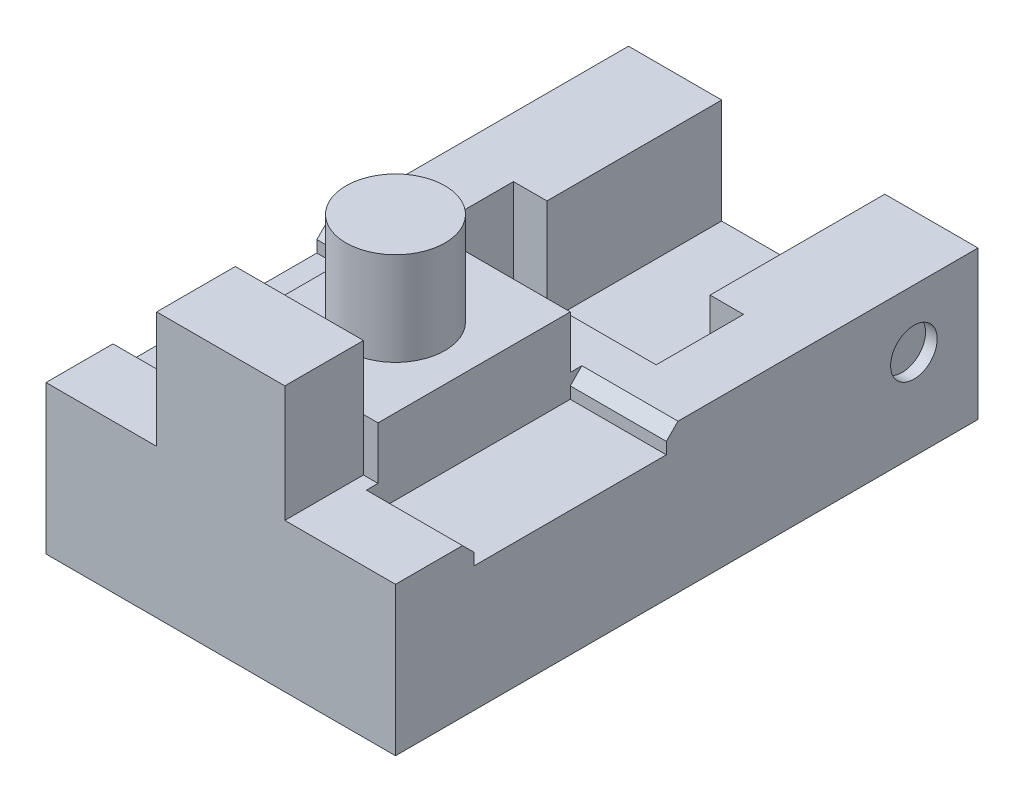
ISO-10303-21;
HEADER;
FILE_DESCRIPTION(('STEP AP214'),'2;1');
FILE_NAME('part.step','',(''),(''),'','','');
FILE_SCHEMA(('AUTOMOTIVE_DESIGN { 1 0 10303 214 1 1 1 1 }'));
ENDSEC;
DATA;
#1=APPLICATION_CONTEXT('core data for automotive mechanical design processes');
#2=APPLICATION_PROTOCOL_DEFINITION('international standard','automotive_design',2000,#1);
#3=PRODUCT_CONTEXT('',#1,'mechanical');
#4=PRODUCT('Part','Part','',(#3));
#5=PRODUCT_RELATED_PRODUCT_CATEGORY('part','',(#4));
#6=PRODUCT_DEFINITION_FORMATION('','',#4);
#7=PRODUCT_DEFINITION_CONTEXT('part definition',#1,'design');
#8=PRODUCT_DEFINITION('design','',#6,#7);
#9=PRODUCT_DEFINITION_SHAPE('','',#8);
#10=(LENGTH_UNIT() NAMED_UNIT(*) SI_UNIT(.MILLI.,.METRE.));
#11=(NAMED_UNIT(*) PLANE_ANGLE_UNIT() SI_UNIT($,.RADIAN.));
#12=(NAMED_UNIT(*) SI_UNIT($,.STERADIAN.) SOLID_ANGLE_UNIT());
#13=UNCERTAINTY_MEASURE_WITH_UNIT(LENGTH_MEASURE(1.E-05),#10,'distance_accuracy_value','');
#14=(GEOMETRIC_REPRESENTATION_CONTEXT(3) GLOBAL_UNCERTAINTY_ASSIGNED_CONTEXT((#13)) GLOBAL_UNIT_ASSIGNED_CONTEXT((#10,
#11,#12)) REPRESENTATION_CONTEXT('',''));
#15=CARTESIAN_POINT('',(0.,0.,0.));
#16=DIRECTION('',(0.,0.,1.));
#17=DIRECTION('',(1.,0.,0.));
#18=AXIS2_PLACEMENT_3D('',#15,#16,#17);
#19=CARTESIAN_POINT('',(0.,1.8,0.));
#20=DIRECTION('',(0.,-1.,0.));
#21=DIRECTION('',(0.,0.,-1.));
#22=AXIS2_PLACEMENT_3D('',#19,#20,#21);
#23=PLANE('',#22);
#24=DIRECTION('',(1.,0.,0.));
#25=VECTOR('',#24,1.);
#26=CARTESIAN_POINT('',(1.35,1.8,5.65));
#27=LINE('',#26,#25);
#28=CARTESIAN_POINT('',(-1.35,1.8,5.65));
#29=VERTEX_POINT('',#28);
#30=CARTESIAN_POINT('',(-1.1,1.8,5.65));
#31=VERTEX_POINT('',#30);
#32=EDGE_CURVE('E407',#29,#31,#27,.T.);
#33=ORIENTED_EDGE('',*,*,#32,.F.);
#34=DIRECTION('',(0.,0.,1.));
#35=VECTOR('',#34,1.);
#36=CARTESIAN_POINT('',(-1.35,1.8,0.));
#37=LINE('',#36,#35);
#38=CARTESIAN_POINT('',(-1.35,1.8,5.85));
#39=VERTEX_POINT('',#38);
#40=EDGE_CURVE('E72',#29,#39,#37,.T.);
#41=ORIENTED_EDGE('',*,*,#40,.T.);
#42=DIRECTION('',(-1.,0.,0.));
#43=VECTOR('',#42,1.);
#44=CARTESIAN_POINT('',(0.,1.8,5.85));
#45=LINE('',#44,#43);
#46=CARTESIAN_POINT('',(-3.,1.8,5.85));
#47=VERTEX_POINT('',#46);
#48=EDGE_CURVE('E565',#39,#47,#45,.T.);
#49=ORIENTED_EDGE('',*,*,#48,.T.);
#50=DIRECTION('',(0.,0.,1.));
#51=VECTOR('',#50,1.);
#52=CARTESIAN_POINT('',(-3.,1.8,7.));
#53=LINE('',#52,#51);
#54=CARTESIAN_POINT('',(-3.,1.8,7.));
#55=VERTEX_POINT('',#54);
#56=EDGE_CURVE('E453',#47,#55,#53,.T.);
#57=ORIENTED_EDGE('',*,*,#56,.T.);
#58=DIRECTION('',(1.,0.,0.));
#59=VECTOR('',#58,1.);
#60=CARTESIAN_POINT('',(-3.,1.8,7.));
#61=LINE('',#60,#59);
#62=CARTESIAN_POINT('',(-1.1,1.8,7.));
#63=VERTEX_POINT('',#62);
#64=EDGE_CURVE('E460',#55,#63,#61,.T.);
#65=ORIENTED_EDGE('',*,*,#64,.T.);
#66=DIRECTION('',(0.,0.,1.));
#67=VECTOR('',#66,1.);
#68=CARTESIAN_POINT('',(-1.1,1.8,5.65));
#69=LINE('',#68,#67);
#70=EDGE_CURVE('E310',#31,#63,#69,.T.);
#71=ORIENTED_EDGE('',*,*,#70,.F.);
#72=EDGE_LOOP('',(#33,#41,#49,#57,#65,#71));
#73=FACE_BOUND('',#72,.T.);
#74=ADVANCED_FACE('F47',(#73),#23,.F.);
#75=CARTESIAN_POINT('',(-3.,1.8,-3.));
#76=VERTEX_POINT('',#75);
#77=CARTESIAN_POINT('',(-3.,1.8,2.15));
#78=VERTEX_POINT('',#77);
#79=EDGE_CURVE('E455',#76,#78,#53,.T.);
#80=ORIENTED_EDGE('',*,*,#79,.T.);
#81=DIRECTION('',(1.,0.,0.));
#82=VECTOR('',#81,1.);
#83=CARTESIAN_POINT('',(0.,1.8,2.15));
#84=LINE('',#83,#82);
#85=CARTESIAN_POINT('',(-1.35,1.8,2.15));
#86=VERTEX_POINT('',#85);
#87=EDGE_CURVE('E587',#78,#86,#84,.T.);
#88=ORIENTED_EDGE('',*,*,#87,.T.);
#89=DIRECTION('',(0.,0.,1.));
#90=VECTOR('',#89,1.);
#91=CARTESIAN_POINT('',(-1.35,1.8,0.));
#92=LINE('',#91,#90);
#93=CARTESIAN_POINT('',(-1.35,1.8,2.35));
#94=VERTEX_POINT('',#93);
#95=EDGE_CURVE('E584',#86,#94,#92,.T.);
#96=ORIENTED_EDGE('',*,*,#95,.T.);
#97=DIRECTION('',(-1.,0.,0.));
#98=VECTOR('',#97,1.);
#99=CARTESIAN_POINT('',(1.35,1.8,2.35));
#100=LINE('',#99,#98);
#101=CARTESIAN_POINT('',(1.35,1.8,2.35));
#102=VERTEX_POINT('',#101);
#103=EDGE_CURVE('E394',#102,#94,#100,.T.);
#104=ORIENTED_EDGE('',*,*,#103,.F.);
#105=DIRECTION('',(0.,0.,-1.));
#106=VECTOR('',#105,1.);
#107=CARTESIAN_POINT('',(1.35,1.8,0.));
#108=LINE('',#107,#106);
#109=CARTESIAN_POINT('',(1.35,1.8,2.15));
#110=VERTEX_POINT('',#109);
#111=EDGE_CURVE('E64',#102,#110,#108,.T.);
#112=ORIENTED_EDGE('',*,*,#111,.T.);
#113=DIRECTION('',(1.,0.,0.));
#114=VECTOR('',#113,1.);
#115=CARTESIAN_POINT('',(0.,1.8,2.15));
#116=LINE('',#115,#114);
#117=CARTESIAN_POINT('',(3.,1.8,2.15));
#118=VERTEX_POINT('',#117);
#119=EDGE_CURVE('E579',#110,#118,#116,.T.);
#120=ORIENTED_EDGE('',*,*,#119,.T.);
#121=DIRECTION('',(0.,0.,-1.));
#122=VECTOR('',#121,1.);
#123=CARTESIAN_POINT('',(3.,1.8,-3.));
#124=LINE('',#123,#122);
#125=CARTESIAN_POINT('',(3.,1.8,-3.));
#126=VERTEX_POINT('',#125);
#127=EDGE_CURVE('E464',#118,#126,#124,.T.);
#128=ORIENTED_EDGE('',*,*,#127,.T.);
#129=DIRECTION('',(-1.,0.,0.));
#130=VECTOR('',#129,1.);
#131=CARTESIAN_POINT('',(1.4,1.8,-3.));
#132=LINE('',#131,#130);
#133=CARTESIAN_POINT('',(1.4,1.8,-3.));
#134=VERTEX_POINT('',#133);
#135=EDGE_CURVE('E469',#126,#134,#132,.T.);
#136=ORIENTED_EDGE('',*,*,#135,.T.);
#137=DIRECTION('',(0.,0.,1.));
#138=VECTOR('',#137,1.);
#139=CARTESIAN_POINT('',(1.4,1.8,0.));
#140=LINE('',#139,#138);
#141=CARTESIAN_POINT('',(1.4,1.8,0.));
#142=VERTEX_POINT('',#141);
#143=EDGE_CURVE('E472',#134,#142,#140,.T.);
#144=ORIENTED_EDGE('',*,*,#143,.T.);
#145=DIRECTION('',(1.,0.,0.));
#146=VECTOR('',#145,1.);
#147=CARTESIAN_POINT('',(1.975,1.8,0.));
#148=LINE('',#147,#146);
#149=CARTESIAN_POINT('',(1.975,1.8,0.));
#150=VERTEX_POINT('',#149);
#151=EDGE_CURVE('E475',#142,#150,#148,.T.);
#152=ORIENTED_EDGE('',*,*,#151,.T.);
#153=DIRECTION('',(0.,0.,1.));
#154=VECTOR('',#153,1.);
#155=CARTESIAN_POINT('',(1.975,1.8,1.5));
#156=LINE('',#155,#154);
#157=CARTESIAN_POINT('',(1.975,1.8,1.5));
#158=VERTEX_POINT('',#157);
#159=EDGE_CURVE('E478',#150,#158,#156,.T.);
#160=ORIENTED_EDGE('',*,*,#159,.T.);
#161=DIRECTION('',(-1.,0.,0.));
#162=VECTOR('',#161,1.);
#163=CARTESIAN_POINT('',(-1.975,1.8,1.5));
#164=LINE('',#163,#162);
#165=CARTESIAN_POINT('',(-1.975,1.8,1.5));
#166=VERTEX_POINT('',#165);
#167=EDGE_CURVE('E481',#158,#166,#164,.T.);
#168=ORIENTED_EDGE('',*,*,#167,.T.);
#169=DIRECTION('',(0.,0.,-1.));
#170=VECTOR('',#169,1.);
#171=CARTESIAN_POINT('',(-1.975,1.8,0.));
#172=LINE('',#171,#170);
#173=CARTESIAN_POINT('',(-1.975,1.8,0.));
#174=VERTEX_POINT('',#173);
#175=EDGE_CURVE('E484',#166,#174,#172,.T.);
#176=ORIENTED_EDGE('',*,*,#175,.T.);
#177=DIRECTION('',(1.,0.,0.));
#178=VECTOR('',#177,1.);
#179=CARTESIAN_POINT('',(-1.4,1.8,0.));
#180=LINE('',#179,#178);
#181=CARTESIAN_POINT('',(-1.4,1.8,0.));
#182=VERTEX_POINT('',#181);
#183=EDGE_CURVE('E487',#174,#182,#180,.T.);
#184=ORIENTED_EDGE('',*,*,#183,.T.);
#185=DIRECTION('',(0.,0.,-1.));
#186=VECTOR('',#185,1.);
#187=CARTESIAN_POINT('',(-1.4,1.8,-3.));
#188=LINE('',#187,#186);
#189=CARTESIAN_POINT('',(-1.4,1.8,-3.));
#190=VERTEX_POINT('',#189);
#191=EDGE_CURVE('E490',#182,#190,#188,.T.);
#192=ORIENTED_EDGE('',*,*,#191,.T.);
#193=DIRECTION('',(-1.,0.,0.));
#194=VECTOR('',#193,1.);
#195=CARTESIAN_POINT('',(-3.,1.8,-3.));
#196=LINE('',#195,#194);
#197=EDGE_CURVE('E449',#190,#76,#196,.T.);
#198=ORIENTED_EDGE('',*,*,#197,.T.);
#199=EDGE_LOOP('',(#80,#88,#96,#104,#112,#120,#128,#136,#144,#152,#160,#168,#176,#184,#192,#198));
#200=FACE_BOUND('',#199,.T.);
#201=ADVANCED_FACE('F623',(#200),#23,.F.);
#202=CARTESIAN_POINT('',(3.,1.8,7.));
#203=VERTEX_POINT('',#202);
#204=CARTESIAN_POINT('',(3.,1.8,5.85));
#205=VERTEX_POINT('',#204);
#206=EDGE_CURVE('E465',#203,#205,#124,.T.);
#207=ORIENTED_EDGE('',*,*,#206,.T.);
#208=DIRECTION('',(-1.,0.,0.));
#209=VECTOR('',#208,1.);
#210=CARTESIAN_POINT('',(0.,1.8,5.85));
#211=LINE('',#210,#209);
#212=CARTESIAN_POINT('',(1.35,1.8,5.85));
#213=VERTEX_POINT('',#212);
#214=EDGE_CURVE('E608',#205,#213,#211,.T.);
#215=ORIENTED_EDGE('',*,*,#214,.T.);
#216=DIRECTION('',(0.,0.,-1.));
#217=VECTOR('',#216,1.);
#218=CARTESIAN_POINT('',(1.35,1.8,0.));
#219=LINE('',#218,#217);
#220=CARTESIAN_POINT('',(1.35,1.8,5.65));
#221=VERTEX_POINT('',#220);
#222=EDGE_CURVE('E605',#213,#221,#219,.T.);
#223=ORIENTED_EDGE('',*,*,#222,.T.);
#224=CARTESIAN_POINT('',(1.1,1.8,5.65));
#225=VERTEX_POINT('',#224);
#226=EDGE_CURVE('E382',#225,#221,#27,.T.);
#227=ORIENTED_EDGE('',*,*,#226,.F.);
#228=DIRECTION('',(0.,0.,-1.));
#229=VECTOR('',#228,1.);
#230=CARTESIAN_POINT('',(1.1,1.8,5.65));
#231=LINE('',#230,#229);
#232=CARTESIAN_POINT('',(1.1,1.8,7.));
#233=VERTEX_POINT('',#232);
#234=EDGE_CURVE('E349',#233,#225,#231,.T.);
#235=ORIENTED_EDGE('',*,*,#234,.F.);
#236=EDGE_CURVE('E459',#233,#203,#61,.T.);
#237=ORIENTED_EDGE('',*,*,#236,.T.);
#238=EDGE_LOOP('',(#207,#215,#223,#227,#235,#237));
#239=FACE_BOUND('',#238,.T.);
#240=ADVANCED_FACE('F646',(#239),#23,.F.);
#241=CARTESIAN_POINT('',(1.35,2.7,5.65));
#242=DIRECTION('',(0.,0.,-1.));
#243=DIRECTION('',(-1.,0.,0.));
#244=AXIS2_PLACEMENT_3D('',#241,#242,#243);
#245=PLANE('',#244);
#246=DIRECTION('',(0.,-1.,0.));
#247=VECTOR('',#246,1.);
#248=CARTESIAN_POINT('',(-1.1,3.8,5.65));
#249=LINE('',#248,#247);
#250=CARTESIAN_POINT('',(-1.1,2.7,5.65));
#251=VERTEX_POINT('',#250);
#252=EDGE_CURVE('E358',#251,#31,#249,.T.);
#253=ORIENTED_EDGE('',*,*,#252,.F.);
#254=DIRECTION('',(1.,0.,0.));
#255=VECTOR('',#254,1.);
#256=CARTESIAN_POINT('',(1.35,2.7,5.65));
#257=LINE('',#256,#255);
#258=CARTESIAN_POINT('',(-1.35,2.7,5.65));
#259=VERTEX_POINT('',#258);
#260=EDGE_CURVE('E395',#259,#251,#257,.T.);
#261=ORIENTED_EDGE('',*,*,#260,.F.);
#262=DIRECTION('',(0.,-1.,0.));
#263=VECTOR('',#262,1.);
#264=CARTESIAN_POINT('',(-1.35,2.7,5.65));
#265=LINE('',#264,#263);
#266=EDGE_CURVE('E424',#259,#29,#265,.T.);
#267=ORIENTED_EDGE('',*,*,#266,.T.);
#268=ORIENTED_EDGE('',*,*,#32,.T.);
#269=EDGE_LOOP('',(#253,#261,#267,#268));
#270=FACE_BOUND('',#269,.T.);
#271=ADVANCED_FACE('F693',(#270),#245,.F.);
#272=DIRECTION('',(0.,-1.,0.));
#273=VECTOR('',#272,1.);
#274=CARTESIAN_POINT('',(1.1,3.8,5.65));
#275=LINE('',#274,#273);
#276=CARTESIAN_POINT('',(1.1,2.7,5.65));
#277=VERTEX_POINT('',#276);
#278=EDGE_CURVE('E368',#277,#225,#275,.T.);
#279=ORIENTED_EDGE('',*,*,#278,.T.);
#280=ORIENTED_EDGE('',*,*,#226,.T.);
#281=DIRECTION('',(0.,-1.,0.));
#282=VECTOR('',#281,1.);
#283=CARTESIAN_POINT('',(1.35,2.7,5.65));
#284=LINE('',#283,#282);
#285=CARTESIAN_POINT('',(1.35,2.7,5.65));
#286=VERTEX_POINT('',#285);
#287=EDGE_CURVE('E420',#286,#221,#284,.T.);
#288=ORIENTED_EDGE('',*,*,#287,.F.);
#289=EDGE_CURVE('E393',#277,#286,#257,.T.);
#290=ORIENTED_EDGE('',*,*,#289,.F.);
#291=EDGE_LOOP('',(#279,#280,#288,#290));
#292=FACE_BOUND('',#291,.T.);
#293=ADVANCED_FACE('F705',(#292),#245,.F.);
#294=CARTESIAN_POINT('',(-3.,1.8,7.));
#295=DIRECTION('',(1.,0.,0.));
#296=DIRECTION('',(0.,0.,-1.));
#297=AXIS2_PLACEMENT_3D('',#294,#295,#296);
#298=PLANE('',#297);
#299=CARTESIAN_POINT('',(-3.,0.8,-1.9));
#300=DIRECTION('',(1.,0.,0.));
#301=DIRECTION('',(0.,0.,-1.));
#302=AXIS2_PLACEMENT_3D('',#299,#300,#301);
#303=CIRCLE('',#302,0.4);
#304=CARTESIAN_POINT('',(-3.,0.8,-2.3));
#305=VERTEX_POINT('',#304);
#306=EDGE_CURVE('E1307',#305,#305,#303,.T.);
#307=ORIENTED_EDGE('',*,*,#306,.T.);
#308=EDGE_LOOP('',(#307));
#309=FACE_BOUND('',#308,.T.);
#310=ORIENTED_EDGE('',*,*,#56,.F.);
#311=DIRECTION('',(0.,0.707106781186545,0.70710678118655));
#312=VECTOR('',#311,1.);
#313=CARTESIAN_POINT('',(-3.,1.6,5.65));
#314=LINE('',#313,#312);
#315=CARTESIAN_POINT('',(-3.,1.6,5.65));
#316=VERTEX_POINT('',#315);
#317=EDGE_CURVE('E573',#47,#316,#314,.F.);
#318=ORIENTED_EDGE('',*,*,#317,.T.);
#319=DIRECTION('',(0.,1.,0.));
#320=VECTOR('',#319,1.);
#321=CARTESIAN_POINT('',(-3.,1.4,5.65));
#322=LINE('',#321,#320);
#323=CARTESIAN_POINT('',(-3.,1.4,5.65));
#324=VERTEX_POINT('',#323);
#325=EDGE_CURVE('E311',#324,#316,#322,.T.);
#326=ORIENTED_EDGE('',*,*,#325,.F.);
#327=DIRECTION('',(0.,0.,1.));
#328=VECTOR('',#327,1.);
#329=CARTESIAN_POINT('',(-3.,1.4,2.35));
#330=LINE('',#329,#328);
#331=CARTESIAN_POINT('',(-3.,1.4,2.35));
#332=VERTEX_POINT('',#331);
#333=EDGE_CURVE('E288',#332,#324,#330,.T.);
#334=ORIENTED_EDGE('',*,*,#333,.F.);
#335=DIRECTION('',(0.,1.,0.));
#336=VECTOR('',#335,1.);
#337=CARTESIAN_POINT('',(-3.,1.4,2.35));
#338=LINE('',#337,#336);
#339=CARTESIAN_POINT('',(-3.,1.6,2.35));
#340=VERTEX_POINT('',#339);
#341=EDGE_CURVE('E278',#332,#340,#338,.T.);
#342=ORIENTED_EDGE('',*,*,#341,.T.);
#343=DIRECTION('',(0.,-0.707106781186545,0.70710678118655));
#344=VECTOR('',#343,1.);
#345=CARTESIAN_POINT('',(-3.,1.6,2.35));
#346=LINE('',#345,#344);
#347=EDGE_CURVE('E570',#340,#78,#346,.F.);
#348=ORIENTED_EDGE('',*,*,#347,.T.);
#349=ORIENTED_EDGE('',*,*,#79,.F.);
#350=DIRECTION('',(0.,-1.,0.));
#351=VECTOR('',#350,1.);
#352=CARTESIAN_POINT('',(-3.,1.8,-3.));
#353=LINE('',#352,#351);
#354=CARTESIAN_POINT('',(-3.,-0.75,-3.));
#355=VERTEX_POINT('',#354);
#356=EDGE_CURVE('E388',#76,#355,#353,.T.);
#357=ORIENTED_EDGE('',*,*,#356,.T.);
#358=DIRECTION('',(0.,0.,-1.));
#359=VECTOR('',#358,1.);
#360=CARTESIAN_POINT('',(-3.,-0.75,-3.));
#361=LINE('',#360,#359);
#362=CARTESIAN_POINT('',(-3.,-0.75,7.));
#363=VERTEX_POINT('',#362);
#364=EDGE_CURVE('E429',#363,#355,#361,.T.);
#365=ORIENTED_EDGE('',*,*,#364,.F.);
#366=DIRECTION('',(0.,-1.,0.));
#367=VECTOR('',#366,1.);
#368=CARTESIAN_POINT('',(-3.,1.8,7.));
#369=LINE('',#368,#367);
#370=EDGE_CURVE('E557',#55,#363,#369,.T.);
#371=ORIENTED_EDGE('',*,*,#370,.F.);
#372=EDGE_LOOP('',(#310,#318,#326,#334,#342,#348,#349,#357,#365,#371));
#373=FACE_BOUND('',#372,.T.);
#374=ADVANCED_FACE('F664',(#309,#373),#298,.F.);
#375=CARTESIAN_POINT('',(-3.,1.8,7.));
#376=DIRECTION('',(0.,0.,-1.));
#377=DIRECTION('',(-1.,0.,0.));
#378=AXIS2_PLACEMENT_3D('',#375,#376,#377);
#379=PLANE('',#378);
#380=ORIENTED_EDGE('',*,*,#370,.T.);
#381=DIRECTION('',(-1.,0.,0.));
#382=VECTOR('',#381,1.);
#383=CARTESIAN_POINT('',(-3.,-0.75,7.));
#384=LINE('',#383,#382);
#385=CARTESIAN_POINT('',(3.,-0.75,7.));
#386=VERTEX_POINT('',#385);
#387=EDGE_CURVE('E441',#386,#363,#384,.T.);
#388=ORIENTED_EDGE('',*,*,#387,.F.);
#389=DIRECTION('',(0.,-1.,0.));
#390=VECTOR('',#389,1.);
#391=CARTESIAN_POINT('',(3.,1.8,7.));
#392=LINE('',#391,#390);
#393=EDGE_CURVE('E554',#203,#386,#392,.T.);
#394=ORIENTED_EDGE('',*,*,#393,.F.);
#395=ORIENTED_EDGE('',*,*,#236,.F.);
#396=DIRECTION('',(0.,-1.,0.));
#397=VECTOR('',#396,1.);
#398=CARTESIAN_POINT('',(1.1,3.8,7.));
#399=LINE('',#398,#397);
#400=CARTESIAN_POINT('',(1.1,3.8,7.));
#401=VERTEX_POINT('',#400);
#402=EDGE_CURVE('E372',#401,#233,#399,.T.);
#403=ORIENTED_EDGE('',*,*,#402,.F.);
#404=DIRECTION('',(1.,0.,0.));
#405=VECTOR('',#404,1.);
#406=CARTESIAN_POINT('',(-1.1,3.8,7.));
#407=LINE('',#406,#405);
#408=CARTESIAN_POINT('',(-1.1,3.8,7.));
#409=VERTEX_POINT('',#408);
#410=EDGE_CURVE('E348',#409,#401,#407,.T.);
#411=ORIENTED_EDGE('',*,*,#410,.F.);
#412=DIRECTION('',(0.,-1.,0.));
#413=VECTOR('',#412,1.);
#414=CARTESIAN_POINT('',(-1.1,3.8,7.));
#415=LINE('',#414,#413);
#416=EDGE_CURVE('E375',#409,#63,#415,.T.);
#417=ORIENTED_EDGE('',*,*,#416,.T.);
#418=ORIENTED_EDGE('',*,*,#64,.F.);
#419=EDGE_LOOP('',(#380,#388,#394,#395,#403,#411,#417,#418));
#420=FACE_BOUND('',#419,.T.);
#421=ADVANCED_FACE('F659',(#420),#379,.F.);
#422=CARTESIAN_POINT('',(3.,1.8,-3.));
#423=DIRECTION('',(-1.,0.,0.));
#424=DIRECTION('',(0.,0.,1.));
#425=AXIS2_PLACEMENT_3D('',#422,#423,#424);
#426=PLANE('',#425);
#427=CARTESIAN_POINT('',(3.,0.8,-1.9));
#428=DIRECTION('',(1.,0.,0.));
#429=DIRECTION('',(0.,0.,-1.));
#430=AXIS2_PLACEMENT_3D('',#427,#428,#429);
#431=CIRCLE('',#430,0.4);
#432=CARTESIAN_POINT('',(3.,0.8,-2.3));
#433=VERTEX_POINT('',#432);
#434=EDGE_CURVE('E300',#433,#433,#431,.T.);
#435=ORIENTED_EDGE('',*,*,#434,.F.);
#436=EDGE_LOOP('',(#435));
#437=FACE_BOUND('',#436,.T.);
#438=ORIENTED_EDGE('',*,*,#127,.F.);
#439=DIRECTION('',(0.,0.707106781186544,-0.707106781186551));
#440=VECTOR('',#439,1.);
#441=CARTESIAN_POINT('',(3.,1.6,2.35));
#442=LINE('',#441,#440);
#443=CARTESIAN_POINT('',(3.,1.6,2.35));
#444=VERTEX_POINT('',#443);
#445=EDGE_CURVE('E598',#118,#444,#442,.F.);
#446=ORIENTED_EDGE('',*,*,#445,.T.);
#447=DIRECTION('',(0.,1.,0.));
#448=VECTOR('',#447,1.);
#449=CARTESIAN_POINT('',(3.,1.4,2.35));
#450=LINE('',#449,#448);
#451=CARTESIAN_POINT('',(3.,1.4,2.35));
#452=VERTEX_POINT('',#451);
#453=EDGE_CURVE('E326',#452,#444,#450,.T.);
#454=ORIENTED_EDGE('',*,*,#453,.F.);
#455=DIRECTION('',(0.,0.,-1.));
#456=VECTOR('',#455,1.);
#457=CARTESIAN_POINT('',(3.,1.4,5.65));
#458=LINE('',#457,#456);
#459=CARTESIAN_POINT('',(3.,1.4,5.65));
#460=VERTEX_POINT('',#459);
#461=EDGE_CURVE('E338',#460,#452,#458,.T.);
#462=ORIENTED_EDGE('',*,*,#461,.F.);
#463=DIRECTION('',(0.,1.,0.));
#464=VECTOR('',#463,1.);
#465=CARTESIAN_POINT('',(3.,1.4,5.65));
#466=LINE('',#465,#464);
#467=CARTESIAN_POINT('',(3.,1.6,5.65));
#468=VERTEX_POINT('',#467);
#469=EDGE_CURVE('E322',#460,#468,#466,.T.);
#470=ORIENTED_EDGE('',*,*,#469,.T.);
#471=DIRECTION('',(0.,-0.707106781186544,-0.707106781186551));
#472=VECTOR('',#471,1.);
#473=CARTESIAN_POINT('',(3.,1.6,5.65));
#474=LINE('',#473,#472);
#475=EDGE_CURVE('E595',#468,#205,#474,.F.);
#476=ORIENTED_EDGE('',*,*,#475,.T.);
#477=ORIENTED_EDGE('',*,*,#206,.F.);
#478=ORIENTED_EDGE('',*,*,#393,.T.);
#479=DIRECTION('',(0.,0.,1.));
#480=VECTOR('',#479,1.);
#481=CARTESIAN_POINT('',(3.,-0.75,7.));
#482=LINE('',#481,#480);
#483=CARTESIAN_POINT('',(3.,-0.75,-3.));
#484=VERTEX_POINT('',#483);
#485=EDGE_CURVE('E437',#484,#386,#482,.T.);
#486=ORIENTED_EDGE('',*,*,#485,.F.);
#487=DIRECTION('',(0.,-1.,0.));
#488=VECTOR('',#487,1.);
#489=CARTESIAN_POINT('',(3.,1.8,-3.));
#490=LINE('',#489,#488);
#491=EDGE_CURVE('E551',#126,#484,#490,.T.);
#492=ORIENTED_EDGE('',*,*,#491,.F.);
#493=EDGE_LOOP('',(#438,#446,#454,#462,#470,#476,#477,#478,#486,#492));
#494=FACE_BOUND('',#493,.T.);
#495=ADVANCED_FACE('F629',(#437,#494),#426,.F.);
#496=CARTESIAN_POINT('',(1.4,1.8,-3.));
#497=DIRECTION('',(0.,0.,1.));
#498=DIRECTION('',(1.,0.,0.));
#499=AXIS2_PLACEMENT_3D('',#496,#497,#498);
#500=PLANE('',#499);
#501=ORIENTED_EDGE('',*,*,#491,.T.);
#502=DIRECTION('',(1.,0.,0.));
#503=VECTOR('',#502,1.);
#504=CARTESIAN_POINT('',(-3.,-0.75,-3.));
#505=LINE('',#504,#503);
#506=EDGE_CURVE('E433',#355,#484,#505,.T.);
#507=ORIENTED_EDGE('',*,*,#506,.F.);
#508=ORIENTED_EDGE('',*,*,#356,.F.);
#509=ORIENTED_EDGE('',*,*,#197,.F.);
#510=DIRECTION('',(0.,-1.,0.));
#511=VECTOR('',#510,1.);
#512=CARTESIAN_POINT('',(-1.4,1.8,-3.));
#513=LINE('',#512,#511);
#514=CARTESIAN_POINT('',(-1.4,0.,-3.));
#515=VERTEX_POINT('',#514);
#516=EDGE_CURVE('E493',#190,#515,#513,.T.);
#517=ORIENTED_EDGE('',*,*,#516,.T.);
#518=DIRECTION('',(1.,0.,0.));
#519=VECTOR('',#518,1.);
#520=CARTESIAN_POINT('',(-3.,0.,-3.));
#521=LINE('',#520,#519);
#522=CARTESIAN_POINT('',(1.4,0.,-3.));
#523=VERTEX_POINT('',#522);
#524=EDGE_CURVE('E428',#515,#523,#521,.T.);
#525=ORIENTED_EDGE('',*,*,#524,.T.);
#526=DIRECTION('',(0.,-1.,0.));
#527=VECTOR('',#526,1.);
#528=CARTESIAN_POINT('',(1.4,1.8,-3.));
#529=LINE('',#528,#527);
#530=EDGE_CURVE('E547',#134,#523,#529,.T.);
#531=ORIENTED_EDGE('',*,*,#530,.F.);
#532=ORIENTED_EDGE('',*,*,#135,.F.);
#533=EDGE_LOOP('',(#501,#507,#508,#509,#517,#525,#531,#532));
#534=FACE_BOUND('',#533,.T.);
#535=ADVANCED_FACE('F669',(#534),#500,.F.);
#536=CARTESIAN_POINT('',(1.4,1.8,0.));
#537=DIRECTION('',(1.,0.,0.));
#538=DIRECTION('',(0.,0.,-1.));
#539=AXIS2_PLACEMENT_3D('',#536,#537,#538);
#540=PLANE('',#539);
#541=DIRECTION('',(0.,0.,1.));
#542=VECTOR('',#541,1.);
#543=CARTESIAN_POINT('',(1.4,0.,0.));
#544=LINE('',#543,#542);
#545=CARTESIAN_POINT('',(1.4,0.,0.));
#546=VERTEX_POINT('',#545);
#547=EDGE_CURVE('E445',#523,#546,#544,.T.);
#548=ORIENTED_EDGE('',*,*,#547,.T.);
#549=DIRECTION('',(0.,-1.,0.));
#550=VECTOR('',#549,1.);
#551=CARTESIAN_POINT('',(1.4,1.8,0.));
#552=LINE('',#551,#550);
#553=EDGE_CURVE('E543',#142,#546,#552,.T.);
#554=ORIENTED_EDGE('',*,*,#553,.F.);
#555=ORIENTED_EDGE('',*,*,#143,.F.);
#556=ORIENTED_EDGE('',*,*,#530,.T.);
#557=EDGE_LOOP('',(#548,#554,#555,#556));
#558=FACE_BOUND('',#557,.T.);
#559=ADVANCED_FACE('F777',(#558),#540,.F.);
#560=CARTESIAN_POINT('',(1.975,1.8,0.));
#561=DIRECTION('',(0.,0.,-1.));
#562=DIRECTION('',(-1.,0.,0.));
#563=AXIS2_PLACEMENT_3D('',#560,#561,#562);
#564=PLANE('',#563);
#565=DIRECTION('',(1.,0.,0.));
#566=VECTOR('',#565,1.);
#567=CARTESIAN_POINT('',(1.975,0.,0.));
#568=LINE('',#567,#566);
#569=CARTESIAN_POINT('',(1.975,0.,0.));
#570=VERTEX_POINT('',#569);
#571=EDGE_CURVE('E497',#546,#570,#568,.T.);
#572=ORIENTED_EDGE('',*,*,#571,.T.);
#573=DIRECTION('',(0.,-1.,0.));
#574=VECTOR('',#573,1.);
#575=CARTESIAN_POINT('',(1.975,1.8,0.));
#576=LINE('',#575,#574);
#577=EDGE_CURVE('E539',#150,#570,#576,.T.);
#578=ORIENTED_EDGE('',*,*,#577,.F.);
#579=ORIENTED_EDGE('',*,*,#151,.F.);
#580=ORIENTED_EDGE('',*,*,#553,.T.);
#581=EDGE_LOOP('',(#572,#578,#579,#580));
#582=FACE_BOUND('',#581,.T.);
#583=ADVANCED_FACE('F774',(#582),#564,.F.);
#584=CARTESIAN_POINT('',(1.975,1.8,1.5));
#585=DIRECTION('',(1.,0.,0.));
#586=DIRECTION('',(0.,0.,-1.));
#587=AXIS2_PLACEMENT_3D('',#584,#585,#586);
#588=PLANE('',#587);
#589=DIRECTION('',(0.,0.,1.));
#590=VECTOR('',#589,1.);
#591=CARTESIAN_POINT('',(1.975,0.,1.5));
#592=LINE('',#591,#590);
#593=CARTESIAN_POINT('',(1.975,0.,1.5));
#594=VERTEX_POINT('',#593);
#595=EDGE_CURVE('E501',#570,#594,#592,.T.);
#596=ORIENTED_EDGE('',*,*,#595,.T.);
#597=DIRECTION('',(0.,-1.,0.));
#598=VECTOR('',#597,1.);
#599=CARTESIAN_POINT('',(1.975,1.8,1.5));
#600=LINE('',#599,#598);
#601=EDGE_CURVE('E535',#158,#594,#600,.T.);
#602=ORIENTED_EDGE('',*,*,#601,.F.);
#603=ORIENTED_EDGE('',*,*,#159,.F.);
#604=ORIENTED_EDGE('',*,*,#577,.T.);
#605=EDGE_LOOP('',(#596,#602,#603,#604));
#606=FACE_BOUND('',#605,.T.);
#607=ADVANCED_FACE('F771',(#606),#588,.F.);
#608=CARTESIAN_POINT('',(-1.975,1.8,1.5));
#609=DIRECTION('',(0.,0.,1.));
#610=DIRECTION('',(1.,0.,0.));
#611=AXIS2_PLACEMENT_3D('',#608,#609,#610);
#612=PLANE('',#611);
#613=DIRECTION('',(-1.,0.,0.));
#614=VECTOR('',#613,1.);
#615=CARTESIAN_POINT('',(-1.975,0.,1.5));
#616=LINE('',#615,#614);
#617=CARTESIAN_POINT('',(-1.975,0.,1.5));
#618=VERTEX_POINT('',#617);
#619=EDGE_CURVE('E505',#594,#618,#616,.T.);
#620=ORIENTED_EDGE('',*,*,#619,.T.);
#621=DIRECTION('',(0.,-1.,0.));
#622=VECTOR('',#621,1.);
#623=CARTESIAN_POINT('',(-1.975,1.8,1.5));
#624=LINE('',#623,#622);
#625=EDGE_CURVE('E531',#166,#618,#624,.T.);
#626=ORIENTED_EDGE('',*,*,#625,.F.);
#627=ORIENTED_EDGE('',*,*,#167,.F.);
#628=ORIENTED_EDGE('',*,*,#601,.T.);
#629=EDGE_LOOP('',(#620,#626,#627,#628));
#630=FACE_BOUND('',#629,.T.);
#631=ADVANCED_FACE('F767',(#630),#612,.F.);
#632=CARTESIAN_POINT('',(-1.975,1.8,0.));
#633=DIRECTION('',(-1.,0.,0.));
#634=DIRECTION('',(0.,0.,1.));
#635=AXIS2_PLACEMENT_3D('',#632,#633,#634);
#636=PLANE('',#635);
#637=DIRECTION('',(0.,0.,-1.));
#638=VECTOR('',#637,1.);
#639=CARTESIAN_POINT('',(-1.975,0.,0.));
#640=LINE('',#639,#638);
#641=CARTESIAN_POINT('',(-1.975,0.,0.));
#642=VERTEX_POINT('',#641);
#643=EDGE_CURVE('E509',#618,#642,#640,.T.);
#644=ORIENTED_EDGE('',*,*,#643,.T.);
#645=DIRECTION('',(0.,-1.,0.));
#646=VECTOR('',#645,1.);
#647=CARTESIAN_POINT('',(-1.975,1.8,0.));
#648=LINE('',#647,#646);
#649=EDGE_CURVE('E527',#174,#642,#648,.T.);
#650=ORIENTED_EDGE('',*,*,#649,.F.);
#651=ORIENTED_EDGE('',*,*,#175,.F.);
#652=ORIENTED_EDGE('',*,*,#625,.T.);
#653=EDGE_LOOP('',(#644,#650,#651,#652));
#654=FACE_BOUND('',#653,.T.);
#655=ADVANCED_FACE('F765',(#654),#636,.F.);
#656=CARTESIAN_POINT('',(-1.4,1.8,0.));
#657=DIRECTION('',(0.,0.,-1.));
#658=DIRECTION('',(-1.,0.,0.));
#659=AXIS2_PLACEMENT_3D('',#656,#657,#658);
#660=PLANE('',#659);
#661=DIRECTION('',(1.,0.,0.));
#662=VECTOR('',#661,1.);
#663=CARTESIAN_POINT('',(-1.4,0.,0.));
#664=LINE('',#663,#662);
#665=CARTESIAN_POINT('',(-1.4,0.,0.));
#666=VERTEX_POINT('',#665);
#667=EDGE_CURVE('E513',#642,#666,#664,.T.);
#668=ORIENTED_EDGE('',*,*,#667,.T.);
#669=DIRECTION('',(0.,-1.,0.));
#670=VECTOR('',#669,1.);
#671=CARTESIAN_POINT('',(-1.4,1.8,0.));
#672=LINE('',#671,#670);
#673=EDGE_CURVE('E523',#182,#666,#672,.T.);
#674=ORIENTED_EDGE('',*,*,#673,.F.);
#675=ORIENTED_EDGE('',*,*,#183,.F.);
#676=ORIENTED_EDGE('',*,*,#649,.T.);
#677=EDGE_LOOP('',(#668,#674,#675,#676));
#678=FACE_BOUND('',#677,.T.);
#679=ADVANCED_FACE('F753',(#678),#660,.F.);
#680=CARTESIAN_POINT('',(-1.4,1.8,-3.));
#681=DIRECTION('',(-1.,0.,0.));
#682=DIRECTION('',(0.,0.,1.));
#683=AXIS2_PLACEMENT_3D('',#680,#681,#682);
#684=PLANE('',#683);
#685=DIRECTION('',(0.,0.,-1.));
#686=VECTOR('',#685,1.);
#687=CARTESIAN_POINT('',(-1.4,0.,-3.));
#688=LINE('',#687,#686);
#689=EDGE_CURVE('E454',#666,#515,#688,.T.);
#690=ORIENTED_EDGE('',*,*,#689,.T.);
#691=ORIENTED_EDGE('',*,*,#516,.F.);
#692=ORIENTED_EDGE('',*,*,#191,.F.);
#693=ORIENTED_EDGE('',*,*,#673,.T.);
#694=EDGE_LOOP('',(#690,#691,#692,#693));
#695=FACE_BOUND('',#694,.T.);
#696=ADVANCED_FACE('F748',(#695),#684,.F.);
#697=CARTESIAN_POINT('',(0.,0.,0.));
#698=DIRECTION('',(0.,1.,0.));
#699=DIRECTION('',(0.,0.,1.));
#700=AXIS2_PLACEMENT_3D('',#697,#698,#699);
#701=PLANE('',#700);
#702=ORIENTED_EDGE('',*,*,#689,.F.);
#703=ORIENTED_EDGE('',*,*,#667,.F.);
#704=ORIENTED_EDGE('',*,*,#643,.F.);
#705=ORIENTED_EDGE('',*,*,#619,.F.);
#706=ORIENTED_EDGE('',*,*,#595,.F.);
#707=ORIENTED_EDGE('',*,*,#571,.F.);
#708=ORIENTED_EDGE('',*,*,#547,.F.);
#709=ORIENTED_EDGE('',*,*,#524,.F.);
#710=EDGE_LOOP('',(#702,#703,#704,#705,#706,#707,#708,#709));
#711=FACE_BOUND('',#710,.T.);
#712=ADVANCED_FACE('F746',(#711),#701,.T.);
#713=CARTESIAN_POINT('',(0.,-0.75,0.));
#714=DIRECTION('',(0.,1.,0.));
#715=DIRECTION('',(0.,0.,1.));
#716=AXIS2_PLACEMENT_3D('',#713,#714,#715);
#717=PLANE('',#716);
#718=ORIENTED_EDGE('',*,*,#364,.T.);
#719=ORIENTED_EDGE('',*,*,#506,.T.);
#720=ORIENTED_EDGE('',*,*,#485,.T.);
#721=ORIENTED_EDGE('',*,*,#387,.T.);
#722=EDGE_LOOP('',(#718,#719,#720,#721));
#723=FACE_BOUND('',#722,.T.);
#724=ADVANCED_FACE('F656',(#723),#717,.F.);
#725=CARTESIAN_POINT('',(-1.35,2.7,5.65));
#726=DIRECTION('',(1.,0.,0.));
#727=DIRECTION('',(0.,0.,-1.));
#728=AXIS2_PLACEMENT_3D('',#725,#726,#727);
#729=PLANE('',#728);
#730=DIRECTION('',(0.,-1.,0.));
#731=VECTOR('',#730,1.);
#732=CARTESIAN_POINT('',(-1.35,2.7,2.35));
#733=LINE('',#732,#731);
#734=CARTESIAN_POINT('',(-1.35,2.7,2.35));
#735=VERTEX_POINT('',#734);
#736=EDGE_CURVE('E406',#735,#94,#733,.T.);
#737=ORIENTED_EDGE('',*,*,#736,.T.);
#738=ORIENTED_EDGE('',*,*,#95,.F.);
#739=DIRECTION('',(0.,0.707106781186545,-0.70710678118655));
#740=VECTOR('',#739,1.);
#741=CARTESIAN_POINT('',(-1.35,0.499999999999996,3.45000000000001));
#742=LINE('',#741,#740);
#743=CARTESIAN_POINT('',(-1.35,1.6,2.35));
#744=VERTEX_POINT('',#743);
#745=EDGE_CURVE('E273',#86,#744,#742,.F.);
#746=ORIENTED_EDGE('',*,*,#745,.T.);
#747=DIRECTION('',(0.,1.,0.));
#748=VECTOR('',#747,1.);
#749=CARTESIAN_POINT('',(-1.35,1.4,2.35));
#750=LINE('',#749,#748);
#751=CARTESIAN_POINT('',(-1.35,1.4,2.35));
#752=VERTEX_POINT('',#751);
#753=EDGE_CURVE('E264',#752,#744,#750,.T.);
#754=ORIENTED_EDGE('',*,*,#753,.F.);
#755=DIRECTION('',(0.,0.,-1.));
#756=VECTOR('',#755,1.);
#757=CARTESIAN_POINT('',(-1.35,1.4,2.35));
#758=LINE('',#757,#756);
#759=CARTESIAN_POINT('',(-1.35,1.4,5.65));
#760=VERTEX_POINT('',#759);
#761=EDGE_CURVE('E270',#760,#752,#758,.T.);
#762=ORIENTED_EDGE('',*,*,#761,.F.);
#763=DIRECTION('',(0.,1.,0.));
#764=VECTOR('',#763,1.);
#765=CARTESIAN_POINT('',(-1.35,1.4,5.65));
#766=LINE('',#765,#764);
#767=CARTESIAN_POINT('',(-1.35,1.6,5.65));
#768=VERTEX_POINT('',#767);
#769=EDGE_CURVE('E307',#760,#768,#766,.T.);
#770=ORIENTED_EDGE('',*,*,#769,.T.);
#771=DIRECTION('',(0.,-0.707106781186545,-0.70710678118655));
#772=VECTOR('',#771,1.);
#773=CARTESIAN_POINT('',(-1.35,2.15,6.2));
#774=LINE('',#773,#772);
#775=EDGE_CURVE('E612',#768,#39,#774,.F.);
#776=ORIENTED_EDGE('',*,*,#775,.T.);
#777=ORIENTED_EDGE('',*,*,#40,.F.);
#778=ORIENTED_EDGE('',*,*,#266,.F.);
#779=DIRECTION('',(0.,0.,1.));
#780=VECTOR('',#779,1.);
#781=CARTESIAN_POINT('',(-1.35,2.7,5.65));
#782=LINE('',#781,#780);
#783=EDGE_CURVE('E389',#735,#259,#782,.T.);
#784=ORIENTED_EDGE('',*,*,#783,.F.);
#785=EDGE_LOOP('',(#737,#738,#746,#754,#762,#770,#776,#777,#778,#784));
#786=FACE_BOUND('',#785,.T.);
#787=ADVANCED_FACE('F267',(#786),#729,.F.);
#788=CARTESIAN_POINT('',(1.35,2.7,5.65));
#789=DIRECTION('',(-1.,0.,0.));
#790=DIRECTION('',(0.,0.,1.));
#791=AXIS2_PLACEMENT_3D('',#788,#789,#790);
#792=PLANE('',#791);
#793=ORIENTED_EDGE('',*,*,#287,.T.);
#794=ORIENTED_EDGE('',*,*,#222,.F.);
#795=DIRECTION('',(0.,0.707106781186544,0.707106781186551));
#796=VECTOR('',#795,1.);
#797=CARTESIAN_POINT('',(1.35,2.15,6.2));
#798=LINE('',#797,#796);
#799=CARTESIAN_POINT('',(1.35,1.6,5.65));
#800=VERTEX_POINT('',#799);
#801=EDGE_CURVE('E11',#213,#800,#798,.F.);
#802=ORIENTED_EDGE('',*,*,#801,.T.);
#803=DIRECTION('',(0.,1.,0.));
#804=VECTOR('',#803,1.);
#805=CARTESIAN_POINT('',(1.35,1.4,5.65));
#806=LINE('',#805,#804);
#807=CARTESIAN_POINT('',(1.35,1.4,5.65));
#808=VERTEX_POINT('',#807);
#809=EDGE_CURVE('E317',#808,#800,#806,.T.);
#810=ORIENTED_EDGE('',*,*,#809,.F.);
#811=DIRECTION('',(0.,0.,1.));
#812=VECTOR('',#811,1.);
#813=CARTESIAN_POINT('',(1.35,1.4,5.65));
#814=LINE('',#813,#812);
#815=CARTESIAN_POINT('',(1.35,1.4,2.35));
#816=VERTEX_POINT('',#815);
#817=EDGE_CURVE('E293',#816,#808,#814,.T.);
#818=ORIENTED_EDGE('',*,*,#817,.F.);
#819=DIRECTION('',(0.,1.,0.));
#820=VECTOR('',#819,1.);
#821=CARTESIAN_POINT('',(1.35,1.4,2.35));
#822=LINE('',#821,#820);
#823=CARTESIAN_POINT('',(1.35,1.6,2.35));
#824=VERTEX_POINT('',#823);
#825=EDGE_CURVE('E330',#816,#824,#822,.T.);
#826=ORIENTED_EDGE('',*,*,#825,.T.);
#827=DIRECTION('',(0.,-0.707106781186544,0.707106781186551));
#828=VECTOR('',#827,1.);
#829=CARTESIAN_POINT('',(1.35,0.499999999999995,3.45000000000001));
#830=LINE('',#829,#828);
#831=EDGE_CURVE('E57',#824,#110,#830,.F.);
#832=ORIENTED_EDGE('',*,*,#831,.T.);
#833=ORIENTED_EDGE('',*,*,#111,.F.);
#834=DIRECTION('',(0.,-1.,0.));
#835=VECTOR('',#834,1.);
#836=CARTESIAN_POINT('',(1.35,2.7,2.35));
#837=LINE('',#836,#835);
#838=CARTESIAN_POINT('',(1.35,2.7,2.35));
#839=VERTEX_POINT('',#838);
#840=EDGE_CURVE('E416',#839,#102,#837,.T.);
#841=ORIENTED_EDGE('',*,*,#840,.F.);
#842=DIRECTION('',(0.,0.,-1.));
#843=VECTOR('',#842,1.);
#844=CARTESIAN_POINT('',(1.35,2.7,5.65));
#845=LINE('',#844,#843);
#846=EDGE_CURVE('E399',#286,#839,#845,.T.);
#847=ORIENTED_EDGE('',*,*,#846,.F.);
#848=EDGE_LOOP('',(#793,#794,#802,#810,#818,#826,#832,#833,#841,#847));
#849=FACE_BOUND('',#848,.T.);
#850=ADVANCED_FACE('F617',(#849),#792,.F.);
#851=CARTESIAN_POINT('',(1.35,2.7,2.35));
#852=DIRECTION('',(0.,0.,1.));
#853=DIRECTION('',(1.,0.,0.));
#854=AXIS2_PLACEMENT_3D('',#851,#852,#853);
#855=PLANE('',#854);
#856=ORIENTED_EDGE('',*,*,#103,.T.);
#857=ORIENTED_EDGE('',*,*,#736,.F.);
#858=DIRECTION('',(-1.,0.,0.));
#859=VECTOR('',#858,1.);
#860=CARTESIAN_POINT('',(1.35,2.7,2.35));
#861=LINE('',#860,#859);
#862=EDGE_CURVE('E403',#839,#735,#861,.T.);
#863=ORIENTED_EDGE('',*,*,#862,.F.);
#864=ORIENTED_EDGE('',*,*,#840,.T.);
#865=EDGE_LOOP('',(#856,#857,#863,#864));
#866=FACE_BOUND('',#865,.T.);
#867=ADVANCED_FACE('F701',(#866),#855,.F.);
#868=CARTESIAN_POINT('',(0.,2.7,0.));
#869=DIRECTION('',(0.,1.,0.));
#870=DIRECTION('',(0.,0.,1.));
#871=AXIS2_PLACEMENT_3D('',#868,#869,#870);
#872=PLANE('',#871);
#873=CARTESIAN_POINT('',(0.,2.7,4.));
#874=DIRECTION('',(0.,1.,0.));
#875=DIRECTION('',(0.,0.,1.));
#876=AXIS2_PLACEMENT_3D('',#873,#874,#875);
#877=CIRCLE('',#876,0.85);
#878=CARTESIAN_POINT('',(0.,2.7,4.85));
#879=VERTEX_POINT('',#878);
#880=EDGE_CURVE('E383',#879,#879,#877,.T.);
#881=ORIENTED_EDGE('',*,*,#880,.F.);
#882=EDGE_LOOP('',(#881));
#883=FACE_BOUND('',#882,.T.);
#884=ORIENTED_EDGE('',*,*,#783,.T.);
#885=ORIENTED_EDGE('',*,*,#260,.T.);
#886=EDGE_CURVE('E400',#251,#277,#257,.T.);
#887=ORIENTED_EDGE('',*,*,#886,.T.);
#888=ORIENTED_EDGE('',*,*,#289,.T.);
#889=ORIENTED_EDGE('',*,*,#846,.T.);
#890=ORIENTED_EDGE('',*,*,#862,.T.);
#891=EDGE_LOOP('',(#884,#885,#887,#888,#889,#890));
#892=FACE_BOUND('',#891,.T.);
#893=ADVANCED_FACE('F697',(#883,#892),#872,.T.);
#894=CARTESIAN_POINT('',(0.,4.3,4.));
#895=DIRECTION('',(0.,-1.,0.));
#896=DIRECTION('',(0.,0.,-1.));
#897=AXIS2_PLACEMENT_3D('',#894,#895,#896);
#898=CYLINDRICAL_SURFACE('',#897,0.85);
#899=CARTESIAN_POINT('',(0.,4.3,4.));
#900=DIRECTION('',(0.,1.,0.));
#901=DIRECTION('',(0.,0.,1.));
#902=AXIS2_PLACEMENT_3D('',#899,#900,#901);
#903=CIRCLE('',#902,0.85);
#904=CARTESIAN_POINT('',(0.,4.3,4.85));
#905=VERTEX_POINT('',#904);
#906=EDGE_CURVE('E378',#905,#905,#903,.T.);
#907=ORIENTED_EDGE('',*,*,#906,.F.);
#908=EDGE_LOOP('',(#907));
#909=FACE_BOUND('',#908,.T.);
#910=ORIENTED_EDGE('',*,*,#880,.T.);
#911=EDGE_LOOP('',(#910));
#912=FACE_BOUND('',#911,.T.);
#913=ADVANCED_FACE('F1095',(#909,#912),#898,.T.);
#914=CARTESIAN_POINT('',(0.,4.3,4.));
#915=DIRECTION('',(0.,1.,0.));
#916=DIRECTION('',(0.,0.,1.));
#917=AXIS2_PLACEMENT_3D('',#914,#915,#916);
#918=PLANE('',#917);
#919=ORIENTED_EDGE('',*,*,#906,.T.);
#920=EDGE_LOOP('',(#919));
#921=FACE_BOUND('',#920,.T.);
#922=ADVANCED_FACE('F1054',(#921),#918,.T.);
#923=CARTESIAN_POINT('',(-1.1,3.8,5.65));
#924=DIRECTION('',(1.,0.,0.));
#925=DIRECTION('',(0.,0.,-1.));
#926=AXIS2_PLACEMENT_3D('',#923,#924,#925);
#927=PLANE('',#926);
#928=ORIENTED_EDGE('',*,*,#70,.T.);
#929=ORIENTED_EDGE('',*,*,#416,.F.);
#930=DIRECTION('',(0.,0.,1.));
#931=VECTOR('',#930,1.);
#932=CARTESIAN_POINT('',(-1.1,3.8,5.65));
#933=LINE('',#932,#931);
#934=CARTESIAN_POINT('',(-1.1,3.8,5.65));
#935=VERTEX_POINT('',#934);
#936=EDGE_CURVE('E344',#935,#409,#933,.T.);
#937=ORIENTED_EDGE('',*,*,#936,.F.);
#938=EDGE_CURVE('E364',#935,#251,#249,.T.);
#939=ORIENTED_EDGE('',*,*,#938,.T.);
#940=ORIENTED_EDGE('',*,*,#252,.T.);
#941=EDGE_LOOP('',(#928,#929,#937,#939,#940));
#942=FACE_BOUND('',#941,.T.);
#943=ADVANCED_FACE('F687',(#942),#927,.F.);
#944=CARTESIAN_POINT('',(1.1,3.8,5.65));
#945=DIRECTION('',(-1.,0.,0.));
#946=DIRECTION('',(0.,0.,1.));
#947=AXIS2_PLACEMENT_3D('',#944,#945,#946);
#948=PLANE('',#947);
#949=ORIENTED_EDGE('',*,*,#234,.T.);
#950=ORIENTED_EDGE('',*,*,#278,.F.);
#951=CARTESIAN_POINT('',(1.1,3.8,5.65));
#952=VERTEX_POINT('',#951);
#953=EDGE_CURVE('E369',#952,#277,#275,.T.);
#954=ORIENTED_EDGE('',*,*,#953,.F.);
#955=DIRECTION('',(0.,0.,-1.));
#956=VECTOR('',#955,1.);
#957=CARTESIAN_POINT('',(1.1,3.8,5.65));
#958=LINE('',#957,#956);
#959=EDGE_CURVE('E352',#401,#952,#958,.T.);
#960=ORIENTED_EDGE('',*,*,#959,.F.);
#961=ORIENTED_EDGE('',*,*,#402,.T.);
#962=EDGE_LOOP('',(#949,#950,#954,#960,#961));
#963=FACE_BOUND('',#962,.T.);
#964=ADVANCED_FACE('F711',(#963),#948,.F.);
#965=CARTESIAN_POINT('',(-1.1,3.8,5.65));
#966=DIRECTION('',(0.,0.,1.));
#967=DIRECTION('',(1.,0.,0.));
#968=AXIS2_PLACEMENT_3D('',#965,#966,#967);
#969=PLANE('',#968);
#970=ORIENTED_EDGE('',*,*,#886,.F.);
#971=ORIENTED_EDGE('',*,*,#938,.F.);
#972=DIRECTION('',(-1.,0.,0.));
#973=VECTOR('',#972,1.);
#974=CARTESIAN_POINT('',(-1.1,3.8,5.65));
#975=LINE('',#974,#973);
#976=EDGE_CURVE('E355',#952,#935,#975,.T.);
#977=ORIENTED_EDGE('',*,*,#976,.F.);
#978=ORIENTED_EDGE('',*,*,#953,.T.);
#979=EDGE_LOOP('',(#970,#971,#977,#978));
#980=FACE_BOUND('',#979,.T.);
#981=ADVANCED_FACE('F716',(#980),#969,.F.);
#982=CARTESIAN_POINT('',(0.,3.8,0.));
#983=DIRECTION('',(0.,1.,0.));
#984=DIRECTION('',(0.,0.,1.));
#985=AXIS2_PLACEMENT_3D('',#982,#983,#984);
#986=PLANE('',#985);
#987=ORIENTED_EDGE('',*,*,#936,.T.);
#988=ORIENTED_EDGE('',*,*,#410,.T.);
#989=ORIENTED_EDGE('',*,*,#959,.T.);
#990=ORIENTED_EDGE('',*,*,#976,.T.);
#991=EDGE_LOOP('',(#987,#988,#989,#990));
#992=FACE_BOUND('',#991,.T.);
#993=ADVANCED_FACE('F714',(#992),#986,.T.);
#994=CARTESIAN_POINT('',(1.35,1.4,2.35));
#995=DIRECTION('',(0.,0.,-1.));
#996=DIRECTION('',(-1.,0.,0.));
#997=AXIS2_PLACEMENT_3D('',#994,#995,#996);
#998=PLANE('',#997);
#999=ORIENTED_EDGE('',*,*,#453,.T.);
#1000=DIRECTION('',(-1.,0.,0.));
#1001=VECTOR('',#1000,1.);
#1002=CARTESIAN_POINT('',(1.35,1.6,2.35));
#1003=LINE('',#1002,#1001);
#1004=EDGE_CURVE('E591',#444,#824,#1003,.T.);
#1005=ORIENTED_EDGE('',*,*,#1004,.T.);
#1006=ORIENTED_EDGE('',*,*,#825,.F.);
#1007=DIRECTION('',(-1.,0.,0.));
#1008=VECTOR('',#1007,1.);
#1009=CARTESIAN_POINT('',(1.35,1.4,2.35));
#1010=LINE('',#1009,#1008);
#1011=EDGE_CURVE('E321',#452,#816,#1010,.T.);
#1012=ORIENTED_EDGE('',*,*,#1011,.F.);
#1013=EDGE_LOOP('',(#999,#1005,#1006,#1012));
#1014=FACE_BOUND('',#1013,.T.);
#1015=ADVANCED_FACE('F634',(#1014),#998,.F.);
#1016=CARTESIAN_POINT('',(1.35,1.4,5.65));
#1017=DIRECTION('',(0.,0.,1.));
#1018=DIRECTION('',(1.,0.,0.));
#1019=AXIS2_PLACEMENT_3D('',#1016,#1017,#1018);
#1020=PLANE('',#1019);
#1021=ORIENTED_EDGE('',*,*,#809,.T.);
#1022=DIRECTION('',(1.,0.,0.));
#1023=VECTOR('',#1022,1.);
#1024=CARTESIAN_POINT('',(1.35,1.6,5.65));
#1025=LINE('',#1024,#1023);
#1026=EDGE_CURVE('E601',#800,#468,#1025,.T.);
#1027=ORIENTED_EDGE('',*,*,#1026,.T.);
#1028=ORIENTED_EDGE('',*,*,#469,.F.);
#1029=DIRECTION('',(1.,0.,0.));
#1030=VECTOR('',#1029,1.);
#1031=CARTESIAN_POINT('',(1.35,1.4,5.65));
#1032=LINE('',#1031,#1030);
#1033=EDGE_CURVE('E297',#808,#460,#1032,.T.);
#1034=ORIENTED_EDGE('',*,*,#1033,.F.);
#1035=EDGE_LOOP('',(#1021,#1027,#1028,#1034));
#1036=FACE_BOUND('',#1035,.T.);
#1037=ADVANCED_FACE('F640',(#1036),#1020,.F.);
#1038=CARTESIAN_POINT('',(0.,1.4,0.));
#1039=DIRECTION('',(0.,-1.,0.));
#1040=DIRECTION('',(0.,0.,-1.));
#1041=AXIS2_PLACEMENT_3D('',#1038,#1039,#1040);
#1042=PLANE('',#1041);
#1043=ORIENTED_EDGE('',*,*,#817,.T.);
#1044=ORIENTED_EDGE('',*,*,#1033,.T.);
#1045=ORIENTED_EDGE('',*,*,#461,.T.);
#1046=ORIENTED_EDGE('',*,*,#1011,.T.);
#1047=EDGE_LOOP('',(#1043,#1044,#1045,#1046));
#1048=FACE_BOUND('',#1047,.T.);
#1049=ADVANCED_FACE('F636',(#1048),#1042,.F.);
#1050=CARTESIAN_POINT('',(-1.35,1.4,5.65));
#1051=DIRECTION('',(0.,0.,1.));
#1052=DIRECTION('',(1.,0.,0.));
#1053=AXIS2_PLACEMENT_3D('',#1050,#1051,#1052);
#1054=PLANE('',#1053);
#1055=ORIENTED_EDGE('',*,*,#325,.T.);
#1056=DIRECTION('',(1.,0.,0.));
#1057=VECTOR('',#1056,1.);
#1058=CARTESIAN_POINT('',(-1.35,1.6,5.65));
#1059=LINE('',#1058,#1057);
#1060=EDGE_CURVE('E387',#316,#768,#1059,.T.);
#1061=ORIENTED_EDGE('',*,*,#1060,.T.);
#1062=ORIENTED_EDGE('',*,*,#769,.F.);
#1063=DIRECTION('',(1.,0.,0.));
#1064=VECTOR('',#1063,1.);
#1065=CARTESIAN_POINT('',(-1.35,1.4,5.65));
#1066=LINE('',#1065,#1064);
#1067=EDGE_CURVE('E279',#324,#760,#1066,.T.);
#1068=ORIENTED_EDGE('',*,*,#1067,.F.);
#1069=EDGE_LOOP('',(#1055,#1061,#1062,#1068));
#1070=FACE_BOUND('',#1069,.T.);
#1071=ADVANCED_FACE('F835',(#1070),#1054,.F.);
#1072=CARTESIAN_POINT('',(-1.35,1.4,2.35));
#1073=DIRECTION('',(0.,0.,-1.));
#1074=DIRECTION('',(-1.,0.,0.));
#1075=AXIS2_PLACEMENT_3D('',#1072,#1073,#1074);
#1076=PLANE('',#1075);
#1077=ORIENTED_EDGE('',*,*,#753,.T.);
#1078=DIRECTION('',(-1.,0.,0.));
#1079=VECTOR('',#1078,1.);
#1080=CARTESIAN_POINT('',(-1.35,1.6,2.35));
#1081=LINE('',#1080,#1079);
#1082=EDGE_CURVE('E576',#744,#340,#1081,.T.);
#1083=ORIENTED_EDGE('',*,*,#1082,.T.);
#1084=ORIENTED_EDGE('',*,*,#341,.F.);
#1085=DIRECTION('',(-1.,0.,0.));
#1086=VECTOR('',#1085,1.);
#1087=CARTESIAN_POINT('',(-1.35,1.4,2.35));
#1088=LINE('',#1087,#1086);
#1089=EDGE_CURVE('E282',#752,#332,#1088,.T.);
#1090=ORIENTED_EDGE('',*,*,#1089,.F.);
#1091=EDGE_LOOP('',(#1077,#1083,#1084,#1090));
#1092=FACE_BOUND('',#1091,.T.);
#1093=ADVANCED_FACE('F283',(#1092),#1076,.F.);
#1094=CARTESIAN_POINT('',(0.,1.4,0.));
#1095=DIRECTION('',(0.,-1.,0.));
#1096=DIRECTION('',(0.,0.,-1.));
#1097=AXIS2_PLACEMENT_3D('',#1094,#1095,#1096);
#1098=PLANE('',#1097);
#1099=ORIENTED_EDGE('',*,*,#761,.T.);
#1100=ORIENTED_EDGE('',*,*,#1089,.T.);
#1101=ORIENTED_EDGE('',*,*,#333,.T.);
#1102=ORIENTED_EDGE('',*,*,#1067,.T.);
#1103=EDGE_LOOP('',(#1099,#1100,#1101,#1102));
#1104=FACE_BOUND('',#1103,.T.);
#1105=ADVANCED_FACE('F290',(#1104),#1098,.F.);
#1106=CARTESIAN_POINT('',(-1.35,1.6,5.65));
#1107=DIRECTION('',(0.,-0.70710678118655,0.707106781186545));
#1108=DIRECTION('',(1.,0.,0.));
#1109=AXIS2_PLACEMENT_3D('',#1106,#1107,#1108);
#1110=PLANE('',#1109);
#1111=ORIENTED_EDGE('',*,*,#317,.F.);
#1112=ORIENTED_EDGE('',*,*,#48,.F.);
#1113=ORIENTED_EDGE('',*,*,#775,.F.);
#1114=ORIENTED_EDGE('',*,*,#1060,.F.);
#1115=EDGE_LOOP('',(#1111,#1112,#1113,#1114));
#1116=FACE_BOUND('',#1115,.T.);
#1117=ADVANCED_FACE('F797',(#1116),#1110,.F.);
#1118=CARTESIAN_POINT('',(-1.35,1.6,2.35));
#1119=DIRECTION('',(0.,-0.70710678118655,-0.707106781186545));
#1120=DIRECTION('',(-1.,0.,0.));
#1121=AXIS2_PLACEMENT_3D('',#1118,#1119,#1120);
#1122=PLANE('',#1121);
#1123=ORIENTED_EDGE('',*,*,#745,.F.);
#1124=ORIENTED_EDGE('',*,*,#87,.F.);
#1125=ORIENTED_EDGE('',*,*,#347,.F.);
#1126=ORIENTED_EDGE('',*,*,#1082,.F.);
#1127=EDGE_LOOP('',(#1123,#1124,#1125,#1126));
#1128=FACE_BOUND('',#1127,.T.);
#1129=ADVANCED_FACE('F803',(#1128),#1122,.F.);
#1130=CARTESIAN_POINT('',(1.35,1.6,2.35));
#1131=DIRECTION('',(0.,-0.707106781186551,-0.707106781186544));
#1132=DIRECTION('',(-1.,0.,0.));
#1133=AXIS2_PLACEMENT_3D('',#1130,#1131,#1132);
#1134=PLANE('',#1133);
#1135=ORIENTED_EDGE('',*,*,#445,.F.);
#1136=ORIENTED_EDGE('',*,*,#119,.F.);
#1137=ORIENTED_EDGE('',*,*,#831,.F.);
#1138=ORIENTED_EDGE('',*,*,#1004,.F.);
#1139=EDGE_LOOP('',(#1135,#1136,#1137,#1138));
#1140=FACE_BOUND('',#1139,.T.);
#1141=ADVANCED_FACE('F626',(#1140),#1134,.F.);
#1142=CARTESIAN_POINT('',(1.35,1.6,5.65));
#1143=DIRECTION('',(0.,-0.707106781186551,0.707106781186544));
#1144=DIRECTION('',(1.,0.,0.));
#1145=AXIS2_PLACEMENT_3D('',#1142,#1143,#1144);
#1146=PLANE('',#1145);
#1147=ORIENTED_EDGE('',*,*,#801,.F.);
#1148=ORIENTED_EDGE('',*,*,#214,.F.);
#1149=ORIENTED_EDGE('',*,*,#475,.F.);
#1150=ORIENTED_EDGE('',*,*,#1026,.F.);
#1151=EDGE_LOOP('',(#1147,#1148,#1149,#1150));
#1152=FACE_BOUND('',#1151,.T.);
#1153=ADVANCED_FACE('F50',(#1152),#1146,.F.);
#1154=CARTESIAN_POINT('',(2.8,0.8,-1.9));
#1155=DIRECTION('',(1.,0.,0.));
#1156=DIRECTION('',(0.,0.,-1.));
#1157=AXIS2_PLACEMENT_3D('',#1154,#1155,#1156);
#1158=CYLINDRICAL_SURFACE('',#1157,0.4);
#1159=CARTESIAN_POINT('',(2.8,0.8,-1.9));
#1160=DIRECTION('',(1.,0.,0.));
#1161=DIRECTION('',(0.,0.,-1.));
#1162=AXIS2_PLACEMENT_3D('',#1159,#1160,#1161);
#1163=CIRCLE('',#1162,0.4);
#1164=CARTESIAN_POINT('',(2.8,0.8,-2.3));
#1165=VERTEX_POINT('',#1164);
#1166=EDGE_CURVE('E334',#1165,#1165,#1163,.T.);
#1167=ORIENTED_EDGE('',*,*,#1166,.F.);
#1168=EDGE_LOOP('',(#1167));
#1169=FACE_BOUND('',#1168,.T.);
#1170=ORIENTED_EDGE('',*,*,#434,.T.);
#1171=EDGE_LOOP('',(#1170));
#1172=FACE_BOUND('',#1171,.T.);
#1173=ADVANCED_FACE('F816',(#1169,#1172),#1158,.F.);
#1174=CARTESIAN_POINT('',(2.8,0.8,-1.9));
#1175=DIRECTION('',(1.,0.,0.));
#1176=DIRECTION('',(0.,0.,-1.));
#1177=AXIS2_PLACEMENT_3D('',#1174,#1175,#1176);
#1178=PLANE('',#1177);
#1179=ORIENTED_EDGE('',*,*,#1166,.T.);
#1180=EDGE_LOOP('',(#1179));
#1181=FACE_BOUND('',#1180,.T.);
#1182=ADVANCED_FACE('F820',(#1181),#1178,.T.);
#1183=CARTESIAN_POINT('',(-2.8,0.8,-1.9));
#1184=DIRECTION('',(-1.,0.,0.));
#1185=DIRECTION('',(0.,0.,1.));
#1186=AXIS2_PLACEMENT_3D('',#1183,#1184,#1185);
#1187=CYLINDRICAL_SURFACE('',#1186,0.4);
#1188=CARTESIAN_POINT('',(-2.8,0.8,-1.9));
#1189=DIRECTION('',(1.,0.,0.));
#1190=DIRECTION('',(0.,0.,-1.));
#1191=AXIS2_PLACEMENT_3D('',#1188,#1189,#1190);
#1192=CIRCLE('',#1191,0.4);
#1193=CARTESIAN_POINT('',(-2.8,0.8,-2.3));
#1194=VERTEX_POINT('',#1193);
#1195=EDGE_CURVE('E1305',#1194,#1194,#1192,.T.);
#1196=ORIENTED_EDGE('',*,*,#1195,.T.);
#1197=EDGE_LOOP('',(#1196));
#1198=FACE_BOUND('',#1197,.T.);
#1199=ORIENTED_EDGE('',*,*,#306,.F.);
#1200=EDGE_LOOP('',(#1199));
#1201=FACE_BOUND('',#1200,.T.);
#1202=ADVANCED_FACE('F826',(#1198,#1201),#1187,.F.);
#1203=CARTESIAN_POINT('',(-2.8,0.8,-1.9));
#1204=DIRECTION('',(-1.,0.,0.));
#1205=DIRECTION('',(0.,0.,-1.));
#1206=AXIS2_PLACEMENT_3D('',#1203,#1204,#1205);
#1207=PLANE('',#1206);
#1208=ORIENTED_EDGE('',*,*,#1195,.F.);
#1209=EDGE_LOOP('',(#1208));
#1210=FACE_BOUND('',#1209,.T.);
#1211=ADVANCED_FACE('F899',(#1210),#1207,.T.);
#1212=CLOSED_SHELL('',(#74,#201,#240,#271,#293,#374,#421,#495,#535,#559,#583,#607,#631,#655,
#679,#696,#712,#724,#787,#850,#867,#893,#913,#922,#943,#964,#981,#993,#1015,#1037,#1049,#1071,
#1093,#1105,#1117,#1129,#1141,#1153,#1173,#1182,#1202,#1211));
#1213=MANIFOLD_SOLID_BREP('B2',#1212);
#1214=ADVANCED_BREP_SHAPE_REPRESENTATION('',(#18,#1213),#14);
#1215=SHAPE_DEFINITION_REPRESENTATION(#9,#1214);
ENDSEC;
END-ISO-10303-21;
